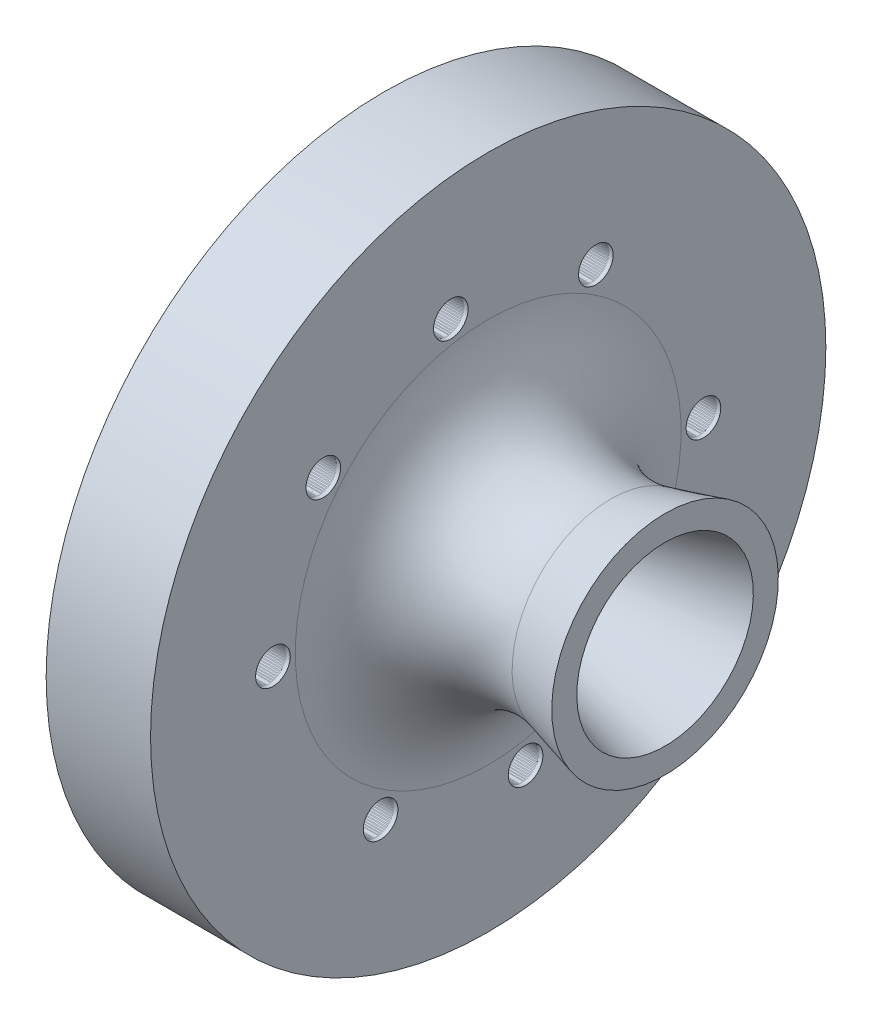
ISO-10303-21;
HEADER;
FILE_DESCRIPTION(('STEP AP214'),'2;1');
FILE_NAME('part.step','',(''),(''),'','','');
FILE_SCHEMA(('AUTOMOTIVE_DESIGN { 1 0 10303 214 1 1 1 1 }'));
ENDSEC;
DATA;
#1=APPLICATION_CONTEXT('core data for automotive mechanical design processes');
#2=APPLICATION_PROTOCOL_DEFINITION('international standard','automotive_design',2000,#1);
#3=PRODUCT_CONTEXT('',#1,'mechanical');
#4=PRODUCT('Part','Part','',(#3));
#5=PRODUCT_RELATED_PRODUCT_CATEGORY('part','',(#4));
#6=PRODUCT_DEFINITION_FORMATION('','',#4);
#7=PRODUCT_DEFINITION_CONTEXT('part definition',#1,'design');
#8=PRODUCT_DEFINITION('design','',#6,#7);
#9=PRODUCT_DEFINITION_SHAPE('','',#8);
#10=(LENGTH_UNIT() NAMED_UNIT(*) SI_UNIT(.MILLI.,.METRE.));
#11=(NAMED_UNIT(*) PLANE_ANGLE_UNIT() SI_UNIT($,.RADIAN.));
#12=(NAMED_UNIT(*) SI_UNIT($,.STERADIAN.) SOLID_ANGLE_UNIT());
#13=UNCERTAINTY_MEASURE_WITH_UNIT(LENGTH_MEASURE(1.E-05),#10,'distance_accuracy_value','');
#14=(GEOMETRIC_REPRESENTATION_CONTEXT(3) GLOBAL_UNCERTAINTY_ASSIGNED_CONTEXT((#13)) GLOBAL_UNIT_ASSIGNED_CONTEXT((#10,
#11,#12)) REPRESENTATION_CONTEXT('',''));
#15=CARTESIAN_POINT('',(0.,0.,0.));
#16=DIRECTION('',(0.,0.,1.));
#17=DIRECTION('',(1.,0.,0.));
#18=AXIS2_PLACEMENT_3D('',#15,#16,#17);
#19=CARTESIAN_POINT('',(-0.394200000000055,-3.8608,0.));
#20=DIRECTION('',(-1.,0.,0.));
#21=DIRECTION('',(0.,-1.,0.));
#22=AXIS2_PLACEMENT_3D('',#19,#20,#21);
#23=CYLINDRICAL_SURFACE('',#22,23.622);
#24=CARTESIAN_POINT('',(-0.394200000000055,-3.8608,0.));
#25=DIRECTION('',(-1.,0.,0.));
#26=DIRECTION('',(0.,-1.,0.));
#27=AXIS2_PLACEMENT_3D('',#24,#25,#26);
#28=CIRCLE('',#27,23.622);
#29=CARTESIAN_POINT('',(-0.394200000000051,-27.4828,0.));
#30=VERTEX_POINT('',#29);
#31=EDGE_CURVE('E11',#30,#30,#28,.T.);
#32=ORIENTED_EDGE('',*,*,#31,.T.);
#33=EDGE_LOOP('',(#32));
#34=FACE_BOUND('',#33,.T.);
#35=CARTESIAN_POINT('',(-4.39420000000005,-3.8608,0.));
#36=DIRECTION('',(-1.,0.,0.));
#37=DIRECTION('',(0.,-1.,0.));
#38=AXIS2_PLACEMENT_3D('',#35,#36,#37);
#39=CIRCLE('',#38,23.622);
#40=CARTESIAN_POINT('',(-4.39420000000004,-27.4828,0.));
#41=VERTEX_POINT('',#40);
#42=EDGE_CURVE('E56',#41,#41,#39,.T.);
#43=ORIENTED_EDGE('',*,*,#42,.F.);
#44=EDGE_LOOP('',(#43));
#45=FACE_BOUND('',#44,.T.);
#46=ADVANCED_FACE('F49',(#34,#45),#23,.T.);
#47=CARTESIAN_POINT('',(-0.394200000000055,-3.8608,0.));
#48=DIRECTION('',(-1.,0.,0.));
#49=DIRECTION('',(0.,-1.,0.));
#50=AXIS2_PLACEMENT_3D('',#47,#48,#49);
#51=PLANE('',#50);
#52=CARTESIAN_POINT('',(-0.394200000000057,13.7392,-10.16));
#53=DIRECTION('',(-1.,0.,0.));
#54=DIRECTION('',(0.,-1.,0.));
#55=AXIS2_PLACEMENT_3D('',#52,#53,#54);
#56=CIRCLE('',#55,1.635);
#57=CARTESIAN_POINT('',(-0.394200000000057,12.1042,-10.16));
#58=VERTEX_POINT('',#57);
#59=EDGE_CURVE('E104',#58,#58,#56,.T.);
#60=ORIENTED_EDGE('',*,*,#59,.T.);
#61=EDGE_LOOP('',(#60));
#62=FACE_BOUND('',#61,.T.);
#63=CARTESIAN_POINT('',(-0.394200000000057,16.1492,3.53));
#64=DIRECTION('',(-1.,0.,0.));
#65=DIRECTION('',(0.,-1.,0.));
#66=AXIS2_PLACEMENT_3D('',#63,#64,#65);
#67=CIRCLE('',#66,1.635);
#68=CARTESIAN_POINT('',(-0.394200000000057,14.5142,3.53));
#69=VERTEX_POINT('',#68);
#70=EDGE_CURVE('E92',#69,#69,#67,.T.);
#71=ORIENTED_EDGE('',*,*,#70,.T.);
#72=EDGE_LOOP('',(#71));
#73=FACE_BOUND('',#72,.T.);
#74=CARTESIAN_POINT('',(-0.394200000000055,-3.86080000000001,20.32));
#75=DIRECTION('',(-1.,0.,0.));
#76=DIRECTION('',(0.,-1.,0.));
#77=AXIS2_PLACEMENT_3D('',#74,#75,#76);
#78=CIRCLE('',#77,1.635);
#79=CARTESIAN_POINT('',(-0.394200000000054,-5.49580000000001,20.32));
#80=VERTEX_POINT('',#79);
#81=EDGE_CURVE('E89',#80,#80,#78,.T.);
#82=ORIENTED_EDGE('',*,*,#81,.T.);
#83=EDGE_LOOP('',(#82));
#84=FACE_BOUND('',#83,.T.);
#85=CARTESIAN_POINT('',(-0.394200000000052,-21.4608,10.16));
#86=DIRECTION('',(-1.,0.,0.));
#87=DIRECTION('',(0.,-1.,0.));
#88=AXIS2_PLACEMENT_3D('',#85,#86,#87);
#89=CIRCLE('',#88,1.635);
#90=CARTESIAN_POINT('',(-0.394200000000052,-23.0958,10.16));
#91=VERTEX_POINT('',#90);
#92=EDGE_CURVE('E86',#91,#91,#89,.T.);
#93=ORIENTED_EDGE('',*,*,#92,.T.);
#94=EDGE_LOOP('',(#93));
#95=FACE_BOUND('',#94,.T.);
#96=CARTESIAN_POINT('',(-0.394200000000052,-23.8708,-3.53));
#97=DIRECTION('',(-1.,0.,0.));
#98=DIRECTION('',(0.,-1.,0.));
#99=AXIS2_PLACEMENT_3D('',#96,#97,#98);
#100=CIRCLE('',#99,1.635);
#101=CARTESIAN_POINT('',(-0.394200000000052,-25.5058,-3.53));
#102=VERTEX_POINT('',#101);
#103=EDGE_CURVE('E82',#102,#102,#100,.T.);
#104=ORIENTED_EDGE('',*,*,#103,.T.);
#105=EDGE_LOOP('',(#104));
#106=FACE_BOUND('',#105,.T.);
#107=CARTESIAN_POINT('',(-0.394200000000053,-16.9208,-15.57));
#108=DIRECTION('',(-1.,0.,0.));
#109=DIRECTION('',(0.,-1.,0.));
#110=AXIS2_PLACEMENT_3D('',#107,#108,#109);
#111=CIRCLE('',#110,1.635);
#112=CARTESIAN_POINT('',(-0.394200000000053,-18.5558,-15.57));
#113=VERTEX_POINT('',#112);
#114=EDGE_CURVE('E78',#113,#113,#111,.T.);
#115=ORIENTED_EDGE('',*,*,#114,.T.);
#116=EDGE_LOOP('',(#115));
#117=FACE_BOUND('',#116,.T.);
#118=CARTESIAN_POINT('',(-0.394200000000055,-3.86080000000001,-20.32));
#119=DIRECTION('',(-1.,0.,0.));
#120=DIRECTION('',(0.,-1.,0.));
#121=AXIS2_PLACEMENT_3D('',#118,#119,#120);
#122=CIRCLE('',#121,1.635);
#123=CARTESIAN_POINT('',(-0.394200000000054,-5.49580000000001,-20.32));
#124=VERTEX_POINT('',#123);
#125=EDGE_CURVE('E74',#124,#124,#122,.T.);
#126=ORIENTED_EDGE('',*,*,#125,.T.);
#127=EDGE_LOOP('',(#126));
#128=FACE_BOUND('',#127,.T.);
#129=CARTESIAN_POINT('',(-0.394200000000056,9.1992,15.57));
#130=DIRECTION('',(-1.,0.,0.));
#131=DIRECTION('',(0.,-1.,0.));
#132=AXIS2_PLACEMENT_3D('',#129,#130,#131);
#133=CIRCLE('',#132,1.635);
#134=CARTESIAN_POINT('',(-0.394200000000056,7.5642,15.57));
#135=VERTEX_POINT('',#134);
#136=EDGE_CURVE('E70',#135,#135,#133,.T.);
#137=ORIENTED_EDGE('',*,*,#136,.T.);
#138=EDGE_LOOP('',(#137));
#139=FACE_BOUND('',#138,.T.);
#140=CARTESIAN_POINT('',(-0.394200000000055,-3.8608,0.));
#141=DIRECTION('',(-1.,0.,0.));
#142=DIRECTION('',(0.,-1.,0.));
#143=AXIS2_PLACEMENT_3D('',#140,#141,#142);
#144=CIRCLE('',#143,10.6172);
#145=CARTESIAN_POINT('',(-0.394200000000053,-14.478,0.));
#146=VERTEX_POINT('',#145);
#147=EDGE_CURVE('E61',#146,#146,#144,.T.);
#148=ORIENTED_EDGE('',*,*,#147,.T.);
#149=EDGE_LOOP('',(#148));
#150=FACE_BOUND('',#149,.T.);
#151=ORIENTED_EDGE('',*,*,#31,.F.);
#152=EDGE_LOOP('',(#151));
#153=FACE_BOUND('',#152,.T.);
#154=ADVANCED_FACE('F117',(#62,#73,#84,#95,#106,#117,#128,#139,#150,#153),#51,.F.);
#155=CARTESIAN_POINT('',(-4.39420000000005,-3.8608,0.));
#156=DIRECTION('',(-1.,0.,0.));
#157=DIRECTION('',(0.,-1.,0.));
#158=AXIS2_PLACEMENT_3D('',#155,#156,#157);
#159=PLANE('',#158);
#160=CARTESIAN_POINT('',(-4.39420000000005,13.7392,-10.16));
#161=DIRECTION('',(-1.,0.,0.));
#162=DIRECTION('',(0.,-1.,0.));
#163=AXIS2_PLACEMENT_3D('',#160,#161,#162);
#164=CIRCLE('',#163,1.635);
#165=CARTESIAN_POINT('',(-4.39420000000005,12.1042,-10.16));
#166=VERTEX_POINT('',#165);
#167=EDGE_CURVE('E52',#166,#166,#164,.T.);
#168=ORIENTED_EDGE('',*,*,#167,.F.);
#169=EDGE_LOOP('',(#168));
#170=FACE_BOUND('',#169,.T.);
#171=CARTESIAN_POINT('',(-4.39420000000005,16.1492,3.53));
#172=DIRECTION('',(-1.,0.,0.));
#173=DIRECTION('',(0.,-1.,0.));
#174=AXIS2_PLACEMENT_3D('',#171,#172,#173);
#175=CIRCLE('',#174,1.635);
#176=CARTESIAN_POINT('',(-4.39420000000005,14.5142,3.53));
#177=VERTEX_POINT('',#176);
#178=EDGE_CURVE('E90',#177,#177,#175,.T.);
#179=ORIENTED_EDGE('',*,*,#178,.F.);
#180=EDGE_LOOP('',(#179));
#181=FACE_BOUND('',#180,.T.);
#182=CARTESIAN_POINT('',(-4.39420000000005,-3.86080000000001,20.32));
#183=DIRECTION('',(-1.,0.,0.));
#184=DIRECTION('',(0.,-1.,0.));
#185=AXIS2_PLACEMENT_3D('',#182,#183,#184);
#186=CIRCLE('',#185,1.635);
#187=CARTESIAN_POINT('',(-4.39420000000005,-5.49580000000001,20.32));
#188=VERTEX_POINT('',#187);
#189=EDGE_CURVE('E87',#188,#188,#186,.T.);
#190=ORIENTED_EDGE('',*,*,#189,.F.);
#191=EDGE_LOOP('',(#190));
#192=FACE_BOUND('',#191,.T.);
#193=CARTESIAN_POINT('',(-4.39420000000004,-21.4608,10.16));
#194=DIRECTION('',(-1.,0.,0.));
#195=DIRECTION('',(0.,-1.,0.));
#196=AXIS2_PLACEMENT_3D('',#193,#194,#195);
#197=CIRCLE('',#196,1.635);
#198=CARTESIAN_POINT('',(-4.39420000000004,-23.0958,10.16));
#199=VERTEX_POINT('',#198);
#200=EDGE_CURVE('E83',#199,#199,#197,.T.);
#201=ORIENTED_EDGE('',*,*,#200,.F.);
#202=EDGE_LOOP('',(#201));
#203=FACE_BOUND('',#202,.T.);
#204=CARTESIAN_POINT('',(-4.39420000000004,-23.8708,-3.53));
#205=DIRECTION('',(-1.,0.,0.));
#206=DIRECTION('',(0.,-1.,0.));
#207=AXIS2_PLACEMENT_3D('',#204,#205,#206);
#208=CIRCLE('',#207,1.635);
#209=CARTESIAN_POINT('',(-4.39420000000004,-25.5058,-3.53));
#210=VERTEX_POINT('',#209);
#211=EDGE_CURVE('E79',#210,#210,#208,.T.);
#212=ORIENTED_EDGE('',*,*,#211,.F.);
#213=EDGE_LOOP('',(#212));
#214=FACE_BOUND('',#213,.T.);
#215=CARTESIAN_POINT('',(-4.39420000000005,-16.9208,-15.57));
#216=DIRECTION('',(-1.,0.,0.));
#217=DIRECTION('',(0.,-1.,0.));
#218=AXIS2_PLACEMENT_3D('',#215,#216,#217);
#219=CIRCLE('',#218,1.635);
#220=CARTESIAN_POINT('',(-4.39420000000005,-18.5558,-15.57));
#221=VERTEX_POINT('',#220);
#222=EDGE_CURVE('E75',#221,#221,#219,.T.);
#223=ORIENTED_EDGE('',*,*,#222,.F.);
#224=EDGE_LOOP('',(#223));
#225=FACE_BOUND('',#224,.T.);
#226=CARTESIAN_POINT('',(-4.39420000000005,-3.86080000000001,-20.32));
#227=DIRECTION('',(-1.,0.,0.));
#228=DIRECTION('',(0.,-1.,0.));
#229=AXIS2_PLACEMENT_3D('',#226,#227,#228);
#230=CIRCLE('',#229,1.635);
#231=CARTESIAN_POINT('',(-4.39420000000005,-5.49580000000001,-20.32));
#232=VERTEX_POINT('',#231);
#233=EDGE_CURVE('E71',#232,#232,#230,.T.);
#234=ORIENTED_EDGE('',*,*,#233,.F.);
#235=EDGE_LOOP('',(#234));
#236=FACE_BOUND('',#235,.T.);
#237=CARTESIAN_POINT('',(-4.39420000000005,9.1992,15.57));
#238=DIRECTION('',(-1.,0.,0.));
#239=DIRECTION('',(0.,-1.,0.));
#240=AXIS2_PLACEMENT_3D('',#237,#238,#239);
#241=CIRCLE('',#240,1.635);
#242=CARTESIAN_POINT('',(-4.39420000000005,7.5642,15.57));
#243=VERTEX_POINT('',#242);
#244=EDGE_CURVE('E67',#243,#243,#241,.T.);
#245=ORIENTED_EDGE('',*,*,#244,.F.);
#246=EDGE_LOOP('',(#245));
#247=FACE_BOUND('',#246,.T.);
#248=CARTESIAN_POINT('',(-4.39420000000005,-3.8608,0.));
#249=DIRECTION('',(-1.,0.,0.));
#250=DIRECTION('',(0.,-1.,0.));
#251=AXIS2_PLACEMENT_3D('',#248,#249,#250);
#252=CIRCLE('',#251,10.6172);
#253=CARTESIAN_POINT('',(-4.39420000000005,-14.478,0.));
#254=VERTEX_POINT('',#253);
#255=EDGE_CURVE('E64',#254,#254,#252,.T.);
#256=ORIENTED_EDGE('',*,*,#255,.F.);
#257=EDGE_LOOP('',(#256));
#258=FACE_BOUND('',#257,.T.);
#259=ORIENTED_EDGE('',*,*,#42,.T.);
#260=EDGE_LOOP('',(#259));
#261=FACE_BOUND('',#260,.T.);
#262=ADVANCED_FACE('F114',(#170,#181,#192,#203,#214,#225,#236,#247,#258,#261),#159,.T.);
#263=CARTESIAN_POINT('',(-0.394200000000055,-3.8608,0.));
#264=DIRECTION('',(-1.,0.,0.));
#265=DIRECTION('',(0.,-1.,0.));
#266=AXIS2_PLACEMENT_3D('',#263,#264,#265);
#267=CYLINDRICAL_SURFACE('',#266,10.6172);
#268=ORIENTED_EDGE('',*,*,#147,.F.);
#269=EDGE_LOOP('',(#268));
#270=FACE_BOUND('',#269,.T.);
#271=ORIENTED_EDGE('',*,*,#255,.T.);
#272=EDGE_LOOP('',(#271));
#273=FACE_BOUND('',#272,.T.);
#274=ADVANCED_FACE('F112',(#270,#273),#267,.F.);
#275=CARTESIAN_POINT('',(4.62447834896002,9.1992,15.57));
#276=DIRECTION('',(-1.,0.,0.));
#277=DIRECTION('',(0.,-1.,0.));
#278=AXIS2_PLACEMENT_3D('',#275,#276,#277);
#279=CYLINDRICAL_SURFACE('',#278,1.635);
#280=ORIENTED_EDGE('',*,*,#244,.T.);
#281=EDGE_LOOP('',(#280));
#282=FACE_BOUND('',#281,.T.);
#283=ORIENTED_EDGE('',*,*,#136,.F.);
#284=EDGE_LOOP('',(#283));
#285=FACE_BOUND('',#284,.T.);
#286=ADVANCED_FACE('F133',(#282,#285),#279,.F.);
#287=CARTESIAN_POINT('',(4.62447834896003,-3.86080000000001,-20.32));
#288=DIRECTION('',(-1.,0.,0.));
#289=DIRECTION('',(0.,-1.,0.));
#290=AXIS2_PLACEMENT_3D('',#287,#288,#289);
#291=CYLINDRICAL_SURFACE('',#290,1.635);
#292=ORIENTED_EDGE('',*,*,#233,.T.);
#293=EDGE_LOOP('',(#292));
#294=FACE_BOUND('',#293,.T.);
#295=ORIENTED_EDGE('',*,*,#125,.F.);
#296=EDGE_LOOP('',(#295));
#297=FACE_BOUND('',#296,.T.);
#298=ADVANCED_FACE('F137',(#294,#297),#291,.F.);
#299=CARTESIAN_POINT('',(4.62447834896003,-16.9208,-15.57));
#300=DIRECTION('',(-1.,0.,0.));
#301=DIRECTION('',(0.,-1.,0.));
#302=AXIS2_PLACEMENT_3D('',#299,#300,#301);
#303=CYLINDRICAL_SURFACE('',#302,1.635);
#304=ORIENTED_EDGE('',*,*,#222,.T.);
#305=EDGE_LOOP('',(#304));
#306=FACE_BOUND('',#305,.T.);
#307=ORIENTED_EDGE('',*,*,#114,.F.);
#308=EDGE_LOOP('',(#307));
#309=FACE_BOUND('',#308,.T.);
#310=ADVANCED_FACE('F141',(#306,#309),#303,.F.);
#311=CARTESIAN_POINT('',(4.62447834896003,-23.8708,-3.53));
#312=DIRECTION('',(-1.,0.,0.));
#313=DIRECTION('',(0.,-1.,0.));
#314=AXIS2_PLACEMENT_3D('',#311,#312,#313);
#315=CYLINDRICAL_SURFACE('',#314,1.635);
#316=ORIENTED_EDGE('',*,*,#211,.T.);
#317=EDGE_LOOP('',(#316));
#318=FACE_BOUND('',#317,.T.);
#319=ORIENTED_EDGE('',*,*,#103,.F.);
#320=EDGE_LOOP('',(#319));
#321=FACE_BOUND('',#320,.T.);
#322=ADVANCED_FACE('F145',(#318,#321),#315,.F.);
#323=CARTESIAN_POINT('',(4.62447834896003,-21.4608,10.16));
#324=DIRECTION('',(-1.,0.,0.));
#325=DIRECTION('',(0.,-1.,0.));
#326=AXIS2_PLACEMENT_3D('',#323,#324,#325);
#327=CYLINDRICAL_SURFACE('',#326,1.635);
#328=ORIENTED_EDGE('',*,*,#200,.T.);
#329=EDGE_LOOP('',(#328));
#330=FACE_BOUND('',#329,.T.);
#331=ORIENTED_EDGE('',*,*,#92,.F.);
#332=EDGE_LOOP('',(#331));
#333=FACE_BOUND('',#332,.T.);
#334=ADVANCED_FACE('F149',(#330,#333),#327,.F.);
#335=CARTESIAN_POINT('',(4.62447834896003,-3.86080000000001,20.32));
#336=DIRECTION('',(-1.,0.,0.));
#337=DIRECTION('',(0.,-1.,0.));
#338=AXIS2_PLACEMENT_3D('',#335,#336,#337);
#339=CYLINDRICAL_SURFACE('',#338,1.635);
#340=ORIENTED_EDGE('',*,*,#189,.T.);
#341=EDGE_LOOP('',(#340));
#342=FACE_BOUND('',#341,.T.);
#343=ORIENTED_EDGE('',*,*,#81,.F.);
#344=EDGE_LOOP('',(#343));
#345=FACE_BOUND('',#344,.T.);
#346=ADVANCED_FACE('F153',(#342,#345),#339,.F.);
#347=CARTESIAN_POINT('',(4.62447834896002,16.1492,3.53));
#348=DIRECTION('',(-1.,0.,0.));
#349=DIRECTION('',(0.,-1.,0.));
#350=AXIS2_PLACEMENT_3D('',#347,#348,#349);
#351=CYLINDRICAL_SURFACE('',#350,1.635);
#352=ORIENTED_EDGE('',*,*,#178,.T.);
#353=EDGE_LOOP('',(#352));
#354=FACE_BOUND('',#353,.T.);
#355=ORIENTED_EDGE('',*,*,#70,.F.);
#356=EDGE_LOOP('',(#355));
#357=FACE_BOUND('',#356,.T.);
#358=ADVANCED_FACE('F157',(#354,#357),#351,.F.);
#359=CARTESIAN_POINT('',(4.62447834896002,13.7392,-10.16));
#360=DIRECTION('',(-1.,0.,0.));
#361=DIRECTION('',(0.,-1.,0.));
#362=AXIS2_PLACEMENT_3D('',#359,#360,#361);
#363=CYLINDRICAL_SURFACE('',#362,1.635);
#364=ORIENTED_EDGE('',*,*,#167,.T.);
#365=EDGE_LOOP('',(#364));
#366=FACE_BOUND('',#365,.T.);
#367=ORIENTED_EDGE('',*,*,#59,.F.);
#368=EDGE_LOOP('',(#367));
#369=FACE_BOUND('',#368,.T.);
#370=ADVANCED_FACE('F161',(#366,#369),#363,.F.);
#371=CLOSED_SHELL('',(#46,#154,#262,#274,#286,#298,#310,#322,#334,#346,#358,#370));
#372=MANIFOLD_SOLID_BREP('B2',#371);
#373=CARTESIAN_POINT('',(-4.39420000000005,6.7564,0.));
#374=DIRECTION('',(-1.,0.,0.));
#375=DIRECTION('',(0.,-1.,0.));
#376=AXIS2_PLACEMENT_3D('',#373,#374,#375);
#377=PLANE('',#376);
#378=CARTESIAN_POINT('',(-4.39420000000005,-3.8608,0.));
#379=DIRECTION('',(1.,0.,0.));
#380=DIRECTION('',(0.,1.,0.));
#381=AXIS2_PLACEMENT_3D('',#378,#379,#380);
#382=CIRCLE('',#381,8.255);
#383=CARTESIAN_POINT('',(-4.39420000000005,4.3942,0.));
#384=VERTEX_POINT('',#383);
#385=EDGE_CURVE('E486',#384,#384,#382,.T.);
#386=ORIENTED_EDGE('',*,*,#385,.T.);
#387=EDGE_LOOP('',(#386));
#388=FACE_BOUND('',#387,.T.);
#389=CARTESIAN_POINT('',(-4.39420000000005,-3.8608,0.));
#390=DIRECTION('',(1.,0.,0.));
#391=DIRECTION('',(0.,1.,0.));
#392=AXIS2_PLACEMENT_3D('',#389,#390,#391);
#393=CIRCLE('',#392,10.6172);
#394=CARTESIAN_POINT('',(-4.39420000000005,6.7564,0.));
#395=VERTEX_POINT('',#394);
#396=EDGE_CURVE('E380',#395,#395,#393,.T.);
#397=ORIENTED_EDGE('',*,*,#396,.F.);
#398=EDGE_LOOP('',(#397));
#399=FACE_BOUND('',#398,.T.);
#400=ADVANCED_FACE('F279',(#388,#399),#377,.T.);
#401=CARTESIAN_POINT('',(-4.39420000000005,-3.8608,0.));
#402=DIRECTION('',(-1.,0.,0.));
#403=DIRECTION('',(0.,-1.,0.));
#404=AXIS2_PLACEMENT_3D('',#401,#402,#403);
#405=CONICAL_SURFACE('',#404,8.255,0.785398163397443);
#406=CARTESIAN_POINT('',(0.,-3.8608,0.));
#407=DIRECTION('',(1.,0.,0.));
#408=DIRECTION('',(0.,1.,0.));
#409=AXIS2_PLACEMENT_3D('',#406,#407,#408);
#410=CIRCLE('',#409,3.8608);
#411=CARTESIAN_POINT('',(0.,0.,0.));
#412=VERTEX_POINT('',#411);
#413=EDGE_CURVE('E482',#412,#412,#410,.T.);
#414=ORIENTED_EDGE('',*,*,#413,.T.);
#415=EDGE_LOOP('',(#414));
#416=FACE_BOUND('',#415,.T.);
#417=ORIENTED_EDGE('',*,*,#385,.F.);
#418=EDGE_LOOP('',(#417));
#419=FACE_BOUND('',#418,.T.);
#420=ADVANCED_FACE('F511',(#416,#419),#405,.F.);
#421=CARTESIAN_POINT('',(0.,-3.8608,0.));
#422=DIRECTION('',(1.,0.,0.));
#423=DIRECTION('',(0.,1.,0.));
#424=AXIS2_PLACEMENT_3D('',#421,#422,#423);
#425=CONICAL_SURFACE('',#424,3.8608,0.261772579874457);
#426=CARTESIAN_POINT('',(16.696,-3.8608,0.));
#427=DIRECTION('',(1.,0.,0.));
#428=DIRECTION('',(0.,1.,0.));
#429=AXIS2_PLACEMENT_3D('',#426,#427,#428);
#430=CIRCLE('',#429,8.334);
#431=CARTESIAN_POINT('',(16.696,4.4732,0.));
#432=VERTEX_POINT('',#431);
#433=EDGE_CURVE('E478',#432,#432,#430,.T.);
#434=ORIENTED_EDGE('',*,*,#433,.T.);
#435=EDGE_LOOP('',(#434));
#436=FACE_BOUND('',#435,.T.);
#437=ORIENTED_EDGE('',*,*,#413,.F.);
#438=EDGE_LOOP('',(#437));
#439=FACE_BOUND('',#438,.T.);
#440=ADVANCED_FACE('F516',(#436,#439),#425,.F.);
#441=CARTESIAN_POINT('',(16.696,6.83539999999999,0.));
#442=DIRECTION('',(1.,0.,0.));
#443=DIRECTION('',(0.,1.,0.));
#444=AXIS2_PLACEMENT_3D('',#441,#442,#443);
#445=PLANE('',#444);
#446=CARTESIAN_POINT('',(16.696,-3.8608,0.));
#447=DIRECTION('',(1.,0.,0.));
#448=DIRECTION('',(0.,1.,0.));
#449=AXIS2_PLACEMENT_3D('',#446,#447,#448);
#450=CIRCLE('',#449,10.6962);
#451=CARTESIAN_POINT('',(16.696,6.83539999999999,0.));
#452=VERTEX_POINT('',#451);
#453=EDGE_CURVE('E474',#452,#452,#450,.T.);
#454=ORIENTED_EDGE('',*,*,#453,.T.);
#455=EDGE_LOOP('',(#454));
#456=FACE_BOUND('',#455,.T.);
#457=ORIENTED_EDGE('',*,*,#433,.F.);
#458=EDGE_LOOP('',(#457));
#459=FACE_BOUND('',#458,.T.);
#460=ADVANCED_FACE('F523',(#456,#459),#445,.T.);
#461=CARTESIAN_POINT('',(16.696,-3.8608,0.));
#462=DIRECTION('',(1.,0.,0.));
#463=DIRECTION('',(0.,1.,0.));
#464=AXIS2_PLACEMENT_3D('',#461,#462,#463);
#465=CONICAL_SURFACE('',#464,10.6962,0.261772579874457);
#466=CARTESIAN_POINT('',(11.5808969849929,-3.8608,0.));
#467=DIRECTION('',(1.,0.,0.));
#468=DIRECTION('',(0.,1.,0.));
#469=AXIS2_PLACEMENT_3D('',#466,#467,#468);
#470=CIRCLE('',#469,9.32575924732094);
#471=CARTESIAN_POINT('',(11.5808969849929,5.46495924732094,0.));
#472=VERTEX_POINT('',#471);
#473=EDGE_CURVE('E288',#472,#472,#470,.T.);
#474=ORIENTED_EDGE('',*,*,#473,.T.);
#475=EDGE_LOOP('',(#474));
#476=FACE_BOUND('',#475,.T.);
#477=ORIENTED_EDGE('',*,*,#453,.F.);
#478=EDGE_LOOP('',(#477));
#479=FACE_BOUND('',#478,.T.);
#480=ADVANCED_FACE('F493',(#476,#479),#465,.T.);
#481=CARTESIAN_POINT('',(0.,28.0154,0.));
#482=DIRECTION('',(1.,0.,0.));
#483=DIRECTION('',(0.,1.,0.));
#484=AXIS2_PLACEMENT_3D('',#481,#482,#483);
#485=PLANE('',#484);
#486=CARTESIAN_POINT('',(0.,-3.8608,0.));
#487=DIRECTION('',(1.,0.,0.));
#488=DIRECTION('',(0.,1.,0.));
#489=AXIS2_PLACEMENT_3D('',#486,#487,#488);
#490=CIRCLE('',#489,18.2123406792807);
#491=CARTESIAN_POINT('',(0.,14.3515406792807,0.));
#492=VERTEX_POINT('',#491);
#493=EDGE_CURVE('E47',#492,#492,#490,.F.);
#494=ORIENTED_EDGE('',*,*,#493,.T.);
#495=EDGE_LOOP('',(#494));
#496=FACE_BOUND('',#495,.T.);
#497=CARTESIAN_POINT('',(0.,13.7392,-10.16));
#498=DIRECTION('',(1.,0.,0.));
#499=DIRECTION('',(0.,1.,0.));
#500=AXIS2_PLACEMENT_3D('',#497,#498,#499);
#501=CIRCLE('',#500,1.635);
#502=CARTESIAN_POINT('',(0.,15.3742,-10.16));
#503=VERTEX_POINT('',#502);
#504=EDGE_CURVE('E375',#503,#503,#501,.F.);
#505=ORIENTED_EDGE('',*,*,#504,.T.);
#506=EDGE_LOOP('',(#505));
#507=FACE_BOUND('',#506,.T.);
#508=CARTESIAN_POINT('',(0.,16.1492,3.53));
#509=DIRECTION('',(1.,0.,0.));
#510=DIRECTION('',(0.,1.,0.));
#511=AXIS2_PLACEMENT_3D('',#508,#509,#510);
#512=CIRCLE('',#511,1.635);
#513=CARTESIAN_POINT('',(0.,17.7842,3.53));
#514=VERTEX_POINT('',#513);
#515=EDGE_CURVE('E376',#514,#514,#512,.F.);
#516=ORIENTED_EDGE('',*,*,#515,.T.);
#517=EDGE_LOOP('',(#516));
#518=FACE_BOUND('',#517,.T.);
#519=CARTESIAN_POINT('',(0.,-3.86080000000001,20.32));
#520=DIRECTION('',(1.,0.,0.));
#521=DIRECTION('',(0.,1.,0.));
#522=AXIS2_PLACEMENT_3D('',#519,#520,#521);
#523=CIRCLE('',#522,1.635);
#524=CARTESIAN_POINT('',(0.,-2.22580000000001,20.32));
#525=VERTEX_POINT('',#524);
#526=EDGE_CURVE('E385',#525,#525,#523,.F.);
#527=ORIENTED_EDGE('',*,*,#526,.T.);
#528=EDGE_LOOP('',(#527));
#529=FACE_BOUND('',#528,.T.);
#530=CARTESIAN_POINT('',(0.,-21.4608,10.16));
#531=DIRECTION('',(1.,0.,0.));
#532=DIRECTION('',(0.,1.,0.));
#533=AXIS2_PLACEMENT_3D('',#530,#531,#532);
#534=CIRCLE('',#533,1.635);
#535=CARTESIAN_POINT('',(0.,-19.8258,10.16));
#536=VERTEX_POINT('',#535);
#537=EDGE_CURVE('E393',#536,#536,#534,.F.);
#538=ORIENTED_EDGE('',*,*,#537,.T.);
#539=EDGE_LOOP('',(#538));
#540=FACE_BOUND('',#539,.T.);
#541=CARTESIAN_POINT('',(0.,-23.8708,-3.53));
#542=DIRECTION('',(1.,0.,0.));
#543=DIRECTION('',(0.,1.,0.));
#544=AXIS2_PLACEMENT_3D('',#541,#542,#543);
#545=CIRCLE('',#544,1.635);
#546=CARTESIAN_POINT('',(0.,-22.2358,-3.53));
#547=VERTEX_POINT('',#546);
#548=EDGE_CURVE('E401',#547,#547,#545,.F.);
#549=ORIENTED_EDGE('',*,*,#548,.T.);
#550=EDGE_LOOP('',(#549));
#551=FACE_BOUND('',#550,.T.);
#552=CARTESIAN_POINT('',(0.,-16.9208,-15.57));
#553=DIRECTION('',(1.,0.,0.));
#554=DIRECTION('',(0.,1.,0.));
#555=AXIS2_PLACEMENT_3D('',#552,#553,#554);
#556=CIRCLE('',#555,1.635);
#557=CARTESIAN_POINT('',(0.,-15.2858,-15.57));
#558=VERTEX_POINT('',#557);
#559=EDGE_CURVE('E409',#558,#558,#556,.F.);
#560=ORIENTED_EDGE('',*,*,#559,.T.);
#561=EDGE_LOOP('',(#560));
#562=FACE_BOUND('',#561,.T.);
#563=CARTESIAN_POINT('',(0.,-3.86080000000001,-20.32));
#564=DIRECTION('',(1.,0.,0.));
#565=DIRECTION('',(0.,1.,0.));
#566=AXIS2_PLACEMENT_3D('',#563,#564,#565);
#567=CIRCLE('',#566,1.635);
#568=CARTESIAN_POINT('',(0.,-2.22580000000001,-20.32));
#569=VERTEX_POINT('',#568);
#570=EDGE_CURVE('E417',#569,#569,#567,.F.);
#571=ORIENTED_EDGE('',*,*,#570,.T.);
#572=EDGE_LOOP('',(#571));
#573=FACE_BOUND('',#572,.T.);
#574=CARTESIAN_POINT('',(0.,9.1992,15.57));
#575=DIRECTION('',(1.,0.,0.));
#576=DIRECTION('',(0.,1.,0.));
#577=AXIS2_PLACEMENT_3D('',#574,#575,#576);
#578=CIRCLE('',#577,1.635);
#579=CARTESIAN_POINT('',(0.,10.8342,15.57));
#580=VERTEX_POINT('',#579);
#581=EDGE_CURVE('E425',#580,#580,#578,.F.);
#582=ORIENTED_EDGE('',*,*,#581,.T.);
#583=EDGE_LOOP('',(#582));
#584=FACE_BOUND('',#583,.T.);
#585=CARTESIAN_POINT('',(0.,-3.8608,0.));
#586=DIRECTION('',(1.,0.,0.));
#587=DIRECTION('',(0.,1.,0.));
#588=AXIS2_PLACEMENT_3D('',#585,#586,#587);
#589=CIRCLE('',#588,31.8762);
#590=CARTESIAN_POINT('',(0.,28.0154,0.));
#591=VERTEX_POINT('',#590);
#592=EDGE_CURVE('E470',#591,#591,#589,.T.);
#593=ORIENTED_EDGE('',*,*,#592,.T.);
#594=EDGE_LOOP('',(#593));
#595=FACE_BOUND('',#594,.T.);
#596=ADVANCED_FACE('F530',(#496,#507,#518,#529,#540,#551,#562,#573,#584,#595),#485,.T.);
#597=CARTESIAN_POINT('',(16.696,-3.8608,0.));
#598=DIRECTION('',(1.,0.,0.));
#599=DIRECTION('',(0.,1.,0.));
#600=AXIS2_PLACEMENT_3D('',#597,#598,#599);
#601=CYLINDRICAL_SURFACE('',#600,31.8762);
#602=CARTESIAN_POINT('',(-9.85520000000005,-3.8608,0.));
#603=DIRECTION('',(1.,0.,0.));
#604=DIRECTION('',(0.,1.,0.));
#605=AXIS2_PLACEMENT_3D('',#602,#603,#604);
#606=CIRCLE('',#605,31.8762);
#607=CARTESIAN_POINT('',(-9.85520000000005,28.0154,0.));
#608=VERTEX_POINT('',#607);
#609=EDGE_CURVE('E466',#608,#608,#606,.T.);
#610=ORIENTED_EDGE('',*,*,#609,.T.);
#611=EDGE_LOOP('',(#610));
#612=FACE_BOUND('',#611,.T.);
#613=ORIENTED_EDGE('',*,*,#592,.F.);
#614=EDGE_LOOP('',(#613));
#615=FACE_BOUND('',#614,.T.);
#616=ADVANCED_FACE('F533',(#612,#615),#601,.T.);
#617=CARTESIAN_POINT('',(-9.85520000000005,28.0154,0.));
#618=DIRECTION('',(-1.,0.,0.));
#619=DIRECTION('',(0.,-1.,0.));
#620=AXIS2_PLACEMENT_3D('',#617,#618,#619);
#621=PLANE('',#620);
#622=DIRECTION('',(0.,0.499949632510924,-0.866054481514987));
#623=VECTOR('',#622,1.);
#624=CARTESIAN_POINT('',(-9.85520000000005,7.02832860641635,-14.0340030317506));
#625=LINE('',#624,#623);
#626=CARTESIAN_POINT('',(-9.85520000000005,7.02832860641635,-14.0340030317506));
#627=VERTEX_POINT('',#626);
#628=CARTESIAN_POINT('',(-9.85520000000005,8.93313670628297,-17.3336706063227));
#629=VERTEX_POINT('',#628);
#630=EDGE_CURVE('E295',#627,#629,#625,.T.);
#631=ORIENTED_EDGE('',*,*,#630,.F.);
#632=DIRECTION('',(0.,0.866054481514987,0.499949632510924));
#633=VECTOR('',#632,1.);
#634=CARTESIAN_POINT('',(-9.85520000000005,7.02832860641635,-14.0340030317506));
#635=LINE('',#634,#633);
#636=CARTESIAN_POINT('',(-9.85520000000005,3.21832860641635,-16.2334121226596));
#637=VERTEX_POINT('',#636);
#638=EDGE_CURVE('E350',#637,#627,#635,.T.);
#639=ORIENTED_EDGE('',*,*,#638,.F.);
#640=DIRECTION('',(0.,-0.499949632510923,0.866054481514987));
#641=VECTOR('',#640,1.);
#642=CARTESIAN_POINT('',(-9.85520000000005,3.21832860641635,-16.2334121226596));
#643=LINE('',#642,#641);
#644=CARTESIAN_POINT('',(-9.85520000000005,5.12313670628297,-19.5330796972317));
#645=VERTEX_POINT('',#644);
#646=EDGE_CURVE('E359',#645,#637,#643,.T.);
#647=ORIENTED_EDGE('',*,*,#646,.F.);
#648=DIRECTION('',(0.,-0.866054481514987,-0.499949632510924));
#649=VECTOR('',#648,1.);
#650=CARTESIAN_POINT('',(-9.85520000000005,8.93313670628297,-17.3336706063227));
#651=LINE('',#650,#649);
#652=EDGE_CURVE('E330',#629,#645,#651,.T.);
#653=ORIENTED_EDGE('',*,*,#652,.F.);
#654=EDGE_LOOP('',(#631,#639,#647,#653));
#655=FACE_BOUND('',#654,.T.);
#656=CARTESIAN_POINT('',(-9.85520000000006,13.7392,-10.16));
#657=DIRECTION('',(-1.,0.,0.));
#658=DIRECTION('',(0.,-1.,0.));
#659=AXIS2_PLACEMENT_3D('',#656,#657,#658);
#660=CIRCLE('',#659,1.635);
#661=CARTESIAN_POINT('',(-9.85520000000006,12.1042,-10.16));
#662=VERTEX_POINT('',#661);
#663=EDGE_CURVE('E371',#662,#662,#660,.T.);
#664=ORIENTED_EDGE('',*,*,#663,.F.);
#665=EDGE_LOOP('',(#664));
#666=FACE_BOUND('',#665,.T.);
#667=CARTESIAN_POINT('',(-9.85520000000006,16.1492,3.53));
#668=DIRECTION('',(-1.,0.,0.));
#669=DIRECTION('',(0.,-1.,0.));
#670=AXIS2_PLACEMENT_3D('',#667,#668,#669);
#671=CIRCLE('',#670,1.635);
#672=CARTESIAN_POINT('',(-9.85520000000006,14.5142,3.53));
#673=VERTEX_POINT('',#672);
#674=EDGE_CURVE('E381',#673,#673,#671,.T.);
#675=ORIENTED_EDGE('',*,*,#674,.F.);
#676=EDGE_LOOP('',(#675));
#677=FACE_BOUND('',#676,.T.);
#678=CARTESIAN_POINT('',(-9.85520000000006,-3.86080000000001,20.32));
#679=DIRECTION('',(-1.,0.,0.));
#680=DIRECTION('',(0.,-1.,0.));
#681=AXIS2_PLACEMENT_3D('',#678,#679,#680);
#682=CIRCLE('',#681,1.635);
#683=CARTESIAN_POINT('',(-9.85520000000006,-5.49580000000001,20.32));
#684=VERTEX_POINT('',#683);
#685=EDGE_CURVE('E389',#684,#684,#682,.T.);
#686=ORIENTED_EDGE('',*,*,#685,.F.);
#687=EDGE_LOOP('',(#686));
#688=FACE_BOUND('',#687,.T.);
#689=CARTESIAN_POINT('',(-9.85520000000005,-21.4608,10.16));
#690=DIRECTION('',(-1.,0.,0.));
#691=DIRECTION('',(0.,-1.,0.));
#692=AXIS2_PLACEMENT_3D('',#689,#690,#691);
#693=CIRCLE('',#692,1.635);
#694=CARTESIAN_POINT('',(-9.85520000000005,-23.0958,10.16));
#695=VERTEX_POINT('',#694);
#696=EDGE_CURVE('E397',#695,#695,#693,.T.);
#697=ORIENTED_EDGE('',*,*,#696,.F.);
#698=EDGE_LOOP('',(#697));
#699=FACE_BOUND('',#698,.T.);
#700=CARTESIAN_POINT('',(-9.85520000000005,-23.8708,-3.53));
#701=DIRECTION('',(-1.,0.,0.));
#702=DIRECTION('',(0.,-1.,0.));
#703=AXIS2_PLACEMENT_3D('',#700,#701,#702);
#704=CIRCLE('',#703,1.635);
#705=CARTESIAN_POINT('',(-9.85520000000005,-25.5058,-3.53));
#706=VERTEX_POINT('',#705);
#707=EDGE_CURVE('E405',#706,#706,#704,.T.);
#708=ORIENTED_EDGE('',*,*,#707,.F.);
#709=EDGE_LOOP('',(#708));
#710=FACE_BOUND('',#709,.T.);
#711=CARTESIAN_POINT('',(-9.85520000000005,-16.9208,-15.57));
#712=DIRECTION('',(-1.,0.,0.));
#713=DIRECTION('',(0.,-1.,0.));
#714=AXIS2_PLACEMENT_3D('',#711,#712,#713);
#715=CIRCLE('',#714,1.635);
#716=CARTESIAN_POINT('',(-9.85520000000005,-18.5558,-15.57));
#717=VERTEX_POINT('',#716);
#718=EDGE_CURVE('E413',#717,#717,#715,.T.);
#719=ORIENTED_EDGE('',*,*,#718,.F.);
#720=EDGE_LOOP('',(#719));
#721=FACE_BOUND('',#720,.T.);
#722=CARTESIAN_POINT('',(-9.85520000000006,-3.86080000000001,-20.32));
#723=DIRECTION('',(-1.,0.,0.));
#724=DIRECTION('',(0.,-1.,0.));
#725=AXIS2_PLACEMENT_3D('',#722,#723,#724);
#726=CIRCLE('',#725,1.635);
#727=CARTESIAN_POINT('',(-9.85520000000006,-5.49580000000001,-20.32));
#728=VERTEX_POINT('',#727);
#729=EDGE_CURVE('E421',#728,#728,#726,.T.);
#730=ORIENTED_EDGE('',*,*,#729,.F.);
#731=EDGE_LOOP('',(#730));
#732=FACE_BOUND('',#731,.T.);
#733=CARTESIAN_POINT('',(-9.85520000000006,9.1992,15.57));
#734=DIRECTION('',(-1.,0.,0.));
#735=DIRECTION('',(0.,-1.,0.));
#736=AXIS2_PLACEMENT_3D('',#733,#734,#735);
#737=CIRCLE('',#736,1.635);
#738=CARTESIAN_POINT('',(-9.85520000000006,7.5642,15.57));
#739=VERTEX_POINT('',#738);
#740=EDGE_CURVE('E366',#739,#739,#737,.T.);
#741=ORIENTED_EDGE('',*,*,#740,.F.);
#742=EDGE_LOOP('',(#741));
#743=FACE_BOUND('',#742,.T.);
#744=CARTESIAN_POINT('',(-9.85520000000005,-3.8608,0.));
#745=DIRECTION('',(1.,0.,0.));
#746=DIRECTION('',(0.,1.,0.));
#747=AXIS2_PLACEMENT_3D('',#744,#745,#746);
#748=CIRCLE('',#747,15.84);
#749=CARTESIAN_POINT('',(-9.85520000000005,11.9792,0.));
#750=VERTEX_POINT('',#749);
#751=EDGE_CURVE('E462',#750,#750,#748,.T.);
#752=ORIENTED_EDGE('',*,*,#751,.T.);
#753=EDGE_LOOP('',(#752));
#754=FACE_BOUND('',#753,.T.);
#755=ORIENTED_EDGE('',*,*,#609,.F.);
#756=EDGE_LOOP('',(#755));
#757=FACE_BOUND('',#756,.T.);
#758=ADVANCED_FACE('F537',(#655,#666,#677,#688,#699,#710,#721,#732,#743,#754,#757),#621,.T.);
#759=CARTESIAN_POINT('',(16.696,-3.8608,0.));
#760=DIRECTION('',(1.,0.,0.));
#761=DIRECTION('',(0.,1.,0.));
#762=AXIS2_PLACEMENT_3D('',#759,#760,#761);
#763=CYLINDRICAL_SURFACE('',#762,15.84);
#764=CARTESIAN_POINT('',(-7.56920000000004,-3.8608,0.));
#765=DIRECTION('',(1.,0.,0.));
#766=DIRECTION('',(0.,1.,0.));
#767=AXIS2_PLACEMENT_3D('',#764,#765,#766);
#768=CIRCLE('',#767,15.84);
#769=CARTESIAN_POINT('',(-7.56920000000005,11.9792,0.));
#770=VERTEX_POINT('',#769);
#771=EDGE_CURVE('E458',#770,#770,#768,.T.);
#772=ORIENTED_EDGE('',*,*,#771,.T.);
#773=EDGE_LOOP('',(#772));
#774=FACE_BOUND('',#773,.T.);
#775=ORIENTED_EDGE('',*,*,#751,.F.);
#776=EDGE_LOOP('',(#775));
#777=FACE_BOUND('',#776,.T.);
#778=ADVANCED_FACE('F541',(#774,#777),#763,.F.);
#779=CARTESIAN_POINT('',(-7.56920000000005,11.9792,0.));
#780=DIRECTION('',(-1.,0.,0.));
#781=DIRECTION('',(0.,-1.,0.));
#782=AXIS2_PLACEMENT_3D('',#779,#780,#781);
#783=PLANE('',#782);
#784=CARTESIAN_POINT('',(-7.56920000000004,-3.8608,0.));
#785=DIRECTION('',(1.,0.,0.));
#786=DIRECTION('',(0.,1.,0.));
#787=AXIS2_PLACEMENT_3D('',#784,#785,#786);
#788=CIRCLE('',#787,14.61);
#789=CARTESIAN_POINT('',(-7.56920000000004,10.7492,0.));
#790=VERTEX_POINT('',#789);
#791=EDGE_CURVE('E454',#790,#790,#788,.T.);
#792=ORIENTED_EDGE('',*,*,#791,.T.);
#793=EDGE_LOOP('',(#792));
#794=FACE_BOUND('',#793,.T.);
#795=ORIENTED_EDGE('',*,*,#771,.F.);
#796=EDGE_LOOP('',(#795));
#797=FACE_BOUND('',#796,.T.);
#798=ADVANCED_FACE('F545',(#794,#797),#783,.T.);
#799=CARTESIAN_POINT('',(16.696,-3.8608,0.));
#800=DIRECTION('',(1.,0.,0.));
#801=DIRECTION('',(0.,1.,0.));
#802=AXIS2_PLACEMENT_3D('',#799,#800,#801);
#803=CYLINDRICAL_SURFACE('',#802,14.61);
#804=CARTESIAN_POINT('',(-4.39420000000005,-3.8608,0.));
#805=DIRECTION('',(1.,0.,0.));
#806=DIRECTION('',(0.,1.,0.));
#807=AXIS2_PLACEMENT_3D('',#804,#805,#806);
#808=CIRCLE('',#807,14.61);
#809=CARTESIAN_POINT('',(-4.39420000000005,10.7492,0.));
#810=VERTEX_POINT('',#809);
#811=EDGE_CURVE('E450',#810,#810,#808,.T.);
#812=ORIENTED_EDGE('',*,*,#811,.T.);
#813=EDGE_LOOP('',(#812));
#814=FACE_BOUND('',#813,.T.);
#815=ORIENTED_EDGE('',*,*,#791,.F.);
#816=EDGE_LOOP('',(#815));
#817=FACE_BOUND('',#816,.T.);
#818=ADVANCED_FACE('F549',(#814,#817),#803,.F.);
#819=CARTESIAN_POINT('',(-4.39420000000005,10.7492,0.));
#820=DIRECTION('',(-1.,0.,0.));
#821=DIRECTION('',(0.,-1.,0.));
#822=AXIS2_PLACEMENT_3D('',#819,#820,#821);
#823=PLANE('',#822);
#824=CARTESIAN_POINT('',(-4.39420000000005,-3.8608,0.));
#825=DIRECTION('',(1.,0.,0.));
#826=DIRECTION('',(0.,1.,0.));
#827=AXIS2_PLACEMENT_3D('',#824,#825,#826);
#828=CIRCLE('',#827,12.75);
#829=CARTESIAN_POINT('',(-4.39420000000005,8.8892,0.));
#830=VERTEX_POINT('',#829);
#831=EDGE_CURVE('E446',#830,#830,#828,.T.);
#832=ORIENTED_EDGE('',*,*,#831,.T.);
#833=EDGE_LOOP('',(#832));
#834=FACE_BOUND('',#833,.T.);
#835=ORIENTED_EDGE('',*,*,#811,.F.);
#836=EDGE_LOOP('',(#835));
#837=FACE_BOUND('',#836,.T.);
#838=ADVANCED_FACE('F553',(#834,#837),#823,.T.);
#839=CARTESIAN_POINT('',(16.696,-3.8608,0.));
#840=DIRECTION('',(1.,0.,0.));
#841=DIRECTION('',(0.,1.,0.));
#842=AXIS2_PLACEMENT_3D('',#839,#840,#841);
#843=CYLINDRICAL_SURFACE('',#842,12.75);
#844=CARTESIAN_POINT('',(-5.68960000000005,-3.8608,0.));
#845=DIRECTION('',(1.,0.,0.));
#846=DIRECTION('',(0.,1.,0.));
#847=AXIS2_PLACEMENT_3D('',#844,#845,#846);
#848=CIRCLE('',#847,12.75);
#849=CARTESIAN_POINT('',(-5.68960000000005,8.8892,0.));
#850=VERTEX_POINT('',#849);
#851=EDGE_CURVE('E442',#850,#850,#848,.T.);
#852=ORIENTED_EDGE('',*,*,#851,.T.);
#853=EDGE_LOOP('',(#852));
#854=FACE_BOUND('',#853,.T.);
#855=ORIENTED_EDGE('',*,*,#831,.F.);
#856=EDGE_LOOP('',(#855));
#857=FACE_BOUND('',#856,.T.);
#858=ADVANCED_FACE('F557',(#854,#857),#843,.T.);
#859=CARTESIAN_POINT('',(-5.68960000000005,8.8892,0.));
#860=DIRECTION('',(-1.,0.,0.));
#861=DIRECTION('',(0.,-1.,0.));
#862=AXIS2_PLACEMENT_3D('',#859,#860,#861);
#863=PLANE('',#862);
#864=CARTESIAN_POINT('',(-5.68960000000005,-3.8608,0.));
#865=DIRECTION('',(1.,0.,0.));
#866=DIRECTION('',(0.,1.,0.));
#867=AXIS2_PLACEMENT_3D('',#864,#865,#866);
#868=CIRCLE('',#867,10.6164);
#869=CARTESIAN_POINT('',(-5.68960000000005,6.7556,0.));
#870=VERTEX_POINT('',#869);
#871=EDGE_CURVE('E438',#870,#870,#868,.T.);
#872=ORIENTED_EDGE('',*,*,#871,.T.);
#873=EDGE_LOOP('',(#872));
#874=FACE_BOUND('',#873,.T.);
#875=ORIENTED_EDGE('',*,*,#851,.F.);
#876=EDGE_LOOP('',(#875));
#877=FACE_BOUND('',#876,.T.);
#878=ADVANCED_FACE('F561',(#874,#877),#863,.T.);
#879=CARTESIAN_POINT('',(-5.68960000000005,-3.8608,0.));
#880=DIRECTION('',(1.,0.,0.));
#881=DIRECTION('',(0.,1.,0.));
#882=AXIS2_PLACEMENT_3D('',#879,#880,#881);
#883=CONICAL_SURFACE('',#882,10.6164,0.000617569784074876);
#884=ORIENTED_EDGE('',*,*,#396,.T.);
#885=EDGE_LOOP('',(#884));
#886=FACE_BOUND('',#885,.T.);
#887=ORIENTED_EDGE('',*,*,#871,.F.);
#888=EDGE_LOOP('',(#887));
#889=FACE_BOUND('',#888,.T.);
#890=ADVANCED_FACE('F565',(#886,#889),#883,.F.);
#891=CARTESIAN_POINT('',(4.62447834896002,9.1992,15.57));
#892=DIRECTION('',(-1.,0.,0.));
#893=DIRECTION('',(0.,-1.,0.));
#894=AXIS2_PLACEMENT_3D('',#891,#892,#893);
#895=CYLINDRICAL_SURFACE('',#894,1.635);
#896=ORIENTED_EDGE('',*,*,#581,.F.);
#897=EDGE_LOOP('',(#896));
#898=FACE_BOUND('',#897,.T.);
#899=ORIENTED_EDGE('',*,*,#740,.T.);
#900=EDGE_LOOP('',(#899));
#901=FACE_BOUND('',#900,.T.);
#902=ADVANCED_FACE('F569',(#898,#901),#895,.F.);
#903=CARTESIAN_POINT('',(4.62447834896003,-3.86080000000001,-20.32));
#904=DIRECTION('',(-1.,0.,0.));
#905=DIRECTION('',(0.,-1.,0.));
#906=AXIS2_PLACEMENT_3D('',#903,#904,#905);
#907=CYLINDRICAL_SURFACE('',#906,1.635);
#908=ORIENTED_EDGE('',*,*,#570,.F.);
#909=EDGE_LOOP('',(#908));
#910=FACE_BOUND('',#909,.T.);
#911=ORIENTED_EDGE('',*,*,#729,.T.);
#912=EDGE_LOOP('',(#911));
#913=FACE_BOUND('',#912,.T.);
#914=ADVANCED_FACE('F573',(#910,#913),#907,.F.);
#915=CARTESIAN_POINT('',(4.62447834896003,-16.9208,-15.57));
#916=DIRECTION('',(-1.,0.,0.));
#917=DIRECTION('',(0.,-1.,0.));
#918=AXIS2_PLACEMENT_3D('',#915,#916,#917);
#919=CYLINDRICAL_SURFACE('',#918,1.635);
#920=ORIENTED_EDGE('',*,*,#559,.F.);
#921=EDGE_LOOP('',(#920));
#922=FACE_BOUND('',#921,.T.);
#923=ORIENTED_EDGE('',*,*,#718,.T.);
#924=EDGE_LOOP('',(#923));
#925=FACE_BOUND('',#924,.T.);
#926=ADVANCED_FACE('F577',(#922,#925),#919,.F.);
#927=CARTESIAN_POINT('',(4.62447834896003,-23.8708,-3.53));
#928=DIRECTION('',(-1.,0.,0.));
#929=DIRECTION('',(0.,-1.,0.));
#930=AXIS2_PLACEMENT_3D('',#927,#928,#929);
#931=CYLINDRICAL_SURFACE('',#930,1.635);
#932=ORIENTED_EDGE('',*,*,#548,.F.);
#933=EDGE_LOOP('',(#932));
#934=FACE_BOUND('',#933,.T.);
#935=ORIENTED_EDGE('',*,*,#707,.T.);
#936=EDGE_LOOP('',(#935));
#937=FACE_BOUND('',#936,.T.);
#938=ADVANCED_FACE('F581',(#934,#937),#931,.F.);
#939=CARTESIAN_POINT('',(4.62447834896003,-21.4608,10.16));
#940=DIRECTION('',(-1.,0.,0.));
#941=DIRECTION('',(0.,-1.,0.));
#942=AXIS2_PLACEMENT_3D('',#939,#940,#941);
#943=CYLINDRICAL_SURFACE('',#942,1.635);
#944=ORIENTED_EDGE('',*,*,#537,.F.);
#945=EDGE_LOOP('',(#944));
#946=FACE_BOUND('',#945,.T.);
#947=ORIENTED_EDGE('',*,*,#696,.T.);
#948=EDGE_LOOP('',(#947));
#949=FACE_BOUND('',#948,.T.);
#950=ADVANCED_FACE('F585',(#946,#949),#943,.F.);
#951=CARTESIAN_POINT('',(4.62447834896003,-3.86080000000001,20.32));
#952=DIRECTION('',(-1.,0.,0.));
#953=DIRECTION('',(0.,-1.,0.));
#954=AXIS2_PLACEMENT_3D('',#951,#952,#953);
#955=CYLINDRICAL_SURFACE('',#954,1.635);
#956=ORIENTED_EDGE('',*,*,#526,.F.);
#957=EDGE_LOOP('',(#956));
#958=FACE_BOUND('',#957,.T.);
#959=ORIENTED_EDGE('',*,*,#685,.T.);
#960=EDGE_LOOP('',(#959));
#961=FACE_BOUND('',#960,.T.);
#962=ADVANCED_FACE('F589',(#958,#961),#955,.F.);
#963=CARTESIAN_POINT('',(4.62447834896002,16.1492,3.53));
#964=DIRECTION('',(-1.,0.,0.));
#965=DIRECTION('',(0.,-1.,0.));
#966=AXIS2_PLACEMENT_3D('',#963,#964,#965);
#967=CYLINDRICAL_SURFACE('',#966,1.635);
#968=ORIENTED_EDGE('',*,*,#515,.F.);
#969=EDGE_LOOP('',(#968));
#970=FACE_BOUND('',#969,.T.);
#971=ORIENTED_EDGE('',*,*,#674,.T.);
#972=EDGE_LOOP('',(#971));
#973=FACE_BOUND('',#972,.T.);
#974=ADVANCED_FACE('F506',(#970,#973),#967,.F.);
#975=CARTESIAN_POINT('',(4.62447834896002,13.7392,-10.16));
#976=DIRECTION('',(-1.,0.,0.));
#977=DIRECTION('',(0.,-1.,0.));
#978=AXIS2_PLACEMENT_3D('',#975,#976,#977);
#979=CYLINDRICAL_SURFACE('',#978,1.635);
#980=ORIENTED_EDGE('',*,*,#504,.F.);
#981=EDGE_LOOP('',(#980));
#982=FACE_BOUND('',#981,.T.);
#983=ORIENTED_EDGE('',*,*,#663,.T.);
#984=EDGE_LOOP('',(#983));
#985=FACE_BOUND('',#984,.T.);
#986=ADVANCED_FACE('F498',(#982,#985),#979,.F.);
#987=CARTESIAN_POINT('',(9.2,-3.8608,0.));
#988=DIRECTION('',(1.,0.,0.));
#989=DIRECTION('',(0.,1.,0.));
#990=AXIS2_PLACEMENT_3D('',#987,#988,#989);
#991=TOROIDAL_SURFACE('',#990,18.2123406792807,9.2);
#992=ORIENTED_EDGE('',*,*,#493,.F.);
#993=EDGE_LOOP('',(#992));
#994=FACE_BOUND('',#993,.T.);
#995=ORIENTED_EDGE('',*,*,#473,.F.);
#996=EDGE_LOOP('',(#995));
#997=FACE_BOUND('',#996,.T.);
#998=ADVANCED_FACE('F281',(#994,#997),#991,.F.);
#999=CARTESIAN_POINT('',(-8.58520000000005,7.02832860641635,-14.0340030317506));
#1000=DIRECTION('',(0.,0.866054481514987,0.499949632510924));
#1001=DIRECTION('',(0.,-0.499949632510924,0.866054481514987));
#1002=AXIS2_PLACEMENT_3D('',#999,#1000,#1001);
#1003=PLANE('',#1002);
#1004=ORIENTED_EDGE('',*,*,#630,.T.);
#1005=DIRECTION('',(-1.,0.,0.));
#1006=VECTOR('',#1005,1.);
#1007=CARTESIAN_POINT('',(-8.58520000000005,8.93313670628297,-17.3336706063227));
#1008=LINE('',#1007,#1006);
#1009=CARTESIAN_POINT('',(-8.58520000000005,8.93313670628297,-17.3336706063227));
#1010=VERTEX_POINT('',#1009);
#1011=EDGE_CURVE('E318',#1010,#629,#1008,.T.);
#1012=ORIENTED_EDGE('',*,*,#1011,.F.);
#1013=DIRECTION('',(0.,0.499949632510924,-0.866054481514987));
#1014=VECTOR('',#1013,1.);
#1015=CARTESIAN_POINT('',(-8.58520000000005,7.02832860641635,-14.0340030317506));
#1016=LINE('',#1015,#1014);
#1017=CARTESIAN_POINT('',(-8.58520000000005,7.02832860641635,-14.0340030317506));
#1018=VERTEX_POINT('',#1017);
#1019=EDGE_CURVE('E346',#1018,#1010,#1016,.T.);
#1020=ORIENTED_EDGE('',*,*,#1019,.F.);
#1021=DIRECTION('',(-1.,0.,0.));
#1022=VECTOR('',#1021,1.);
#1023=CARTESIAN_POINT('',(-8.58520000000005,7.02832860641635,-14.0340030317506));
#1024=LINE('',#1023,#1022);
#1025=EDGE_CURVE('E303',#1018,#627,#1024,.T.);
#1026=ORIENTED_EDGE('',*,*,#1025,.T.);
#1027=EDGE_LOOP('',(#1004,#1012,#1020,#1026));
#1028=FACE_BOUND('',#1027,.T.);
#1029=ADVANCED_FACE('F497',(#1028),#1003,.F.);
#1030=CARTESIAN_POINT('',(-8.58520000000005,7.02832860641635,-14.0340030317506));
#1031=DIRECTION('',(0.,-0.499949632510924,0.866054481514987));
#1032=DIRECTION('',(0.,-0.866054481514987,-0.499949632510924));
#1033=AXIS2_PLACEMENT_3D('',#1030,#1031,#1032);
#1034=PLANE('',#1033);
#1035=ORIENTED_EDGE('',*,*,#638,.T.);
#1036=ORIENTED_EDGE('',*,*,#1025,.F.);
#1037=DIRECTION('',(0.,0.866054481514987,0.499949632510924));
#1038=VECTOR('',#1037,1.);
#1039=CARTESIAN_POINT('',(-8.58520000000005,7.02832860641635,-14.0340030317506));
#1040=LINE('',#1039,#1038);
#1041=CARTESIAN_POINT('',(-8.58520000000005,3.21832860641635,-16.2334121226596));
#1042=VERTEX_POINT('',#1041);
#1043=EDGE_CURVE('E343',#1042,#1018,#1040,.T.);
#1044=ORIENTED_EDGE('',*,*,#1043,.F.);
#1045=DIRECTION('',(-1.,0.,0.));
#1046=VECTOR('',#1045,1.);
#1047=CARTESIAN_POINT('',(-8.58520000000005,3.21832860641635,-16.2334121226596));
#1048=LINE('',#1047,#1046);
#1049=EDGE_CURVE('E335',#1042,#637,#1048,.T.);
#1050=ORIENTED_EDGE('',*,*,#1049,.T.);
#1051=EDGE_LOOP('',(#1035,#1036,#1044,#1050));
#1052=FACE_BOUND('',#1051,.T.);
#1053=ADVANCED_FACE('F504',(#1052),#1034,.F.);
#1054=CARTESIAN_POINT('',(-8.58520000000005,3.21832860641635,-16.2334121226596));
#1055=DIRECTION('',(0.,-0.866054481514987,-0.499949632510923));
#1056=DIRECTION('',(0.,0.499949632510923,-0.866054481514987));
#1057=AXIS2_PLACEMENT_3D('',#1054,#1055,#1056);
#1058=PLANE('',#1057);
#1059=ORIENTED_EDGE('',*,*,#646,.T.);
#1060=ORIENTED_EDGE('',*,*,#1049,.F.);
#1061=DIRECTION('',(0.,-0.499949632510923,0.866054481514987));
#1062=VECTOR('',#1061,1.);
#1063=CARTESIAN_POINT('',(-8.58520000000005,3.21832860641635,-16.2334121226596));
#1064=LINE('',#1063,#1062);
#1065=CARTESIAN_POINT('',(-8.58520000000005,5.12313670628297,-19.5330796972317));
#1066=VERTEX_POINT('',#1065);
#1067=EDGE_CURVE('E338',#1066,#1042,#1064,.T.);
#1068=ORIENTED_EDGE('',*,*,#1067,.F.);
#1069=DIRECTION('',(-1.,0.,0.));
#1070=VECTOR('',#1069,1.);
#1071=CARTESIAN_POINT('',(-8.58520000000005,5.12313670628297,-19.5330796972317));
#1072=LINE('',#1071,#1070);
#1073=EDGE_CURVE('E323',#1066,#645,#1072,.T.);
#1074=ORIENTED_EDGE('',*,*,#1073,.T.);
#1075=EDGE_LOOP('',(#1059,#1060,#1068,#1074));
#1076=FACE_BOUND('',#1075,.T.);
#1077=ADVANCED_FACE('F339',(#1076),#1058,.F.);
#1078=CARTESIAN_POINT('',(-8.58520000000005,8.93313670628297,-17.3336706063227));
#1079=DIRECTION('',(0.,0.499949632510924,-0.866054481514987));
#1080=DIRECTION('',(0.,0.866054481514987,0.499949632510924));
#1081=AXIS2_PLACEMENT_3D('',#1078,#1079,#1080);
#1082=PLANE('',#1081);
#1083=ORIENTED_EDGE('',*,*,#652,.T.);
#1084=ORIENTED_EDGE('',*,*,#1073,.F.);
#1085=DIRECTION('',(0.,-0.866054481514987,-0.499949632510924));
#1086=VECTOR('',#1085,1.);
#1087=CARTESIAN_POINT('',(-8.58520000000005,8.93313670628297,-17.3336706063227));
#1088=LINE('',#1087,#1086);
#1089=EDGE_CURVE('E327',#1010,#1066,#1088,.T.);
#1090=ORIENTED_EDGE('',*,*,#1089,.F.);
#1091=ORIENTED_EDGE('',*,*,#1011,.T.);
#1092=EDGE_LOOP('',(#1083,#1084,#1090,#1091));
#1093=FACE_BOUND('',#1092,.T.);
#1094=ADVANCED_FACE('F325',(#1093),#1082,.F.);
#1095=CARTESIAN_POINT('',(-8.58520000000005,0.,0.));
#1096=DIRECTION('',(-1.,0.,0.));
#1097=DIRECTION('',(0.,-1.,0.));
#1098=AXIS2_PLACEMENT_3D('',#1095,#1096,#1097);
#1099=PLANE('',#1098);
#1100=ORIENTED_EDGE('',*,*,#1019,.T.);
#1101=ORIENTED_EDGE('',*,*,#1089,.T.);
#1102=ORIENTED_EDGE('',*,*,#1067,.T.);
#1103=ORIENTED_EDGE('',*,*,#1043,.T.);
#1104=EDGE_LOOP('',(#1100,#1101,#1102,#1103));
#1105=FACE_BOUND('',#1104,.T.);
#1106=ADVANCED_FACE('F345',(#1105),#1099,.T.);
#1107=CLOSED_SHELL('',(#400,#420,#440,#460,#480,#596,#616,#758,#778,#798,#818,#838,#858,#878,
#890,#902,#914,#926,#938,#950,#962,#974,#986,#998,#1029,#1053,#1077,#1094,#1106));
#1108=MANIFOLD_SOLID_BREP('B6',#1107);
#1109=ADVANCED_BREP_SHAPE_REPRESENTATION('',(#18,#372,#1108),#14);
#1110=SHAPE_DEFINITION_REPRESENTATION(#9,#1109);
ENDSEC;
END-ISO-10303-21;
